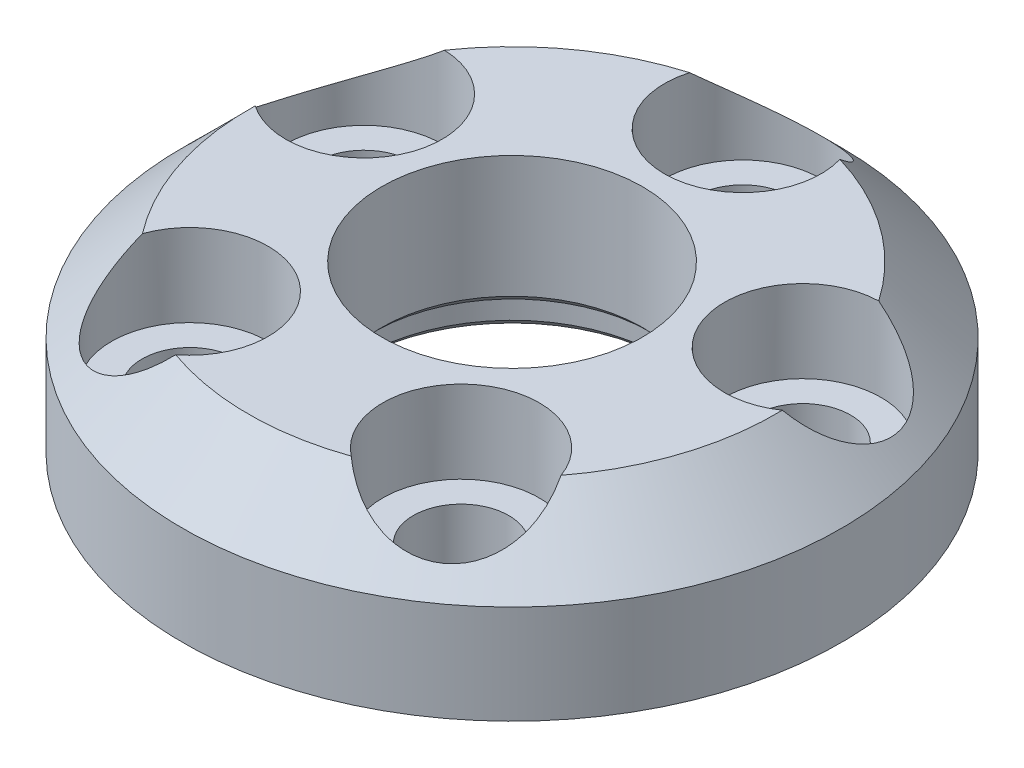
ISO-10303-21;
HEADER;
FILE_DESCRIPTION(('STEP AP214'),'2;1');
FILE_NAME('part.step','',(''),(''),'','','');
FILE_SCHEMA(('AUTOMOTIVE_DESIGN { 1 0 10303 214 1 1 1 1 }'));
ENDSEC;
DATA;
#1=APPLICATION_CONTEXT('core data for automotive mechanical design processes');
#2=APPLICATION_PROTOCOL_DEFINITION('international standard','automotive_design',2000,#1);
#3=PRODUCT_CONTEXT('',#1,'mechanical');
#4=PRODUCT('Part','Part','',(#3));
#5=PRODUCT_RELATED_PRODUCT_CATEGORY('part','',(#4));
#6=PRODUCT_DEFINITION_FORMATION('','',#4);
#7=PRODUCT_DEFINITION_CONTEXT('part definition',#1,'design');
#8=PRODUCT_DEFINITION('design','',#6,#7);
#9=PRODUCT_DEFINITION_SHAPE('','',#8);
#10=(LENGTH_UNIT() NAMED_UNIT(*) SI_UNIT(.MILLI.,.METRE.));
#11=(NAMED_UNIT(*) PLANE_ANGLE_UNIT() SI_UNIT($,.RADIAN.));
#12=(NAMED_UNIT(*) SI_UNIT($,.STERADIAN.) SOLID_ANGLE_UNIT());
#13=UNCERTAINTY_MEASURE_WITH_UNIT(LENGTH_MEASURE(1.E-05),#10,'distance_accuracy_value','');
#14=(GEOMETRIC_REPRESENTATION_CONTEXT(3) GLOBAL_UNCERTAINTY_ASSIGNED_CONTEXT((#13)) GLOBAL_UNIT_ASSIGNED_CONTEXT((#10,
#11,#12)) REPRESENTATION_CONTEXT('',''));
#15=CARTESIAN_POINT('',(0.,0.,0.));
#16=DIRECTION('',(0.,0.,1.));
#17=DIRECTION('',(1.,0.,0.));
#18=AXIS2_PLACEMENT_3D('',#15,#16,#17);
#19=CARTESIAN_POINT('',(0.,1.05000000002065,0.));
#20=DIRECTION('',(0.,-1.,0.));
#21=DIRECTION('',(0.,0.,-1.));
#22=AXIS2_PLACEMENT_3D('',#19,#20,#21);
#23=CONICAL_SURFACE('',#22,4.20750000006365,0.785398163397448);
#24=CARTESIAN_POINT('',(0.,1.29999999999999,0.));
#25=DIRECTION('',(0.,-1.,0.));
#26=DIRECTION('',(0.,0.,-1.));
#27=AXIS2_PLACEMENT_3D('',#24,#25,#26);
#28=CIRCLE('',#27,3.9575);
#29=CARTESIAN_POINT('',(0.,1.29999999999999,-3.9575));
#30=VERTEX_POINT('',#29);
#31=EDGE_CURVE('E203',#30,#30,#28,.F.);
#32=ORIENTED_EDGE('',*,*,#31,.T.);
#33=EDGE_LOOP('',(#32));
#34=FACE_BOUND('',#33,.T.);
#35=CARTESIAN_POINT('',(0.,1.05000000002065,0.));
#36=DIRECTION('',(0.,-1.,0.));
#37=DIRECTION('',(0.,0.,-1.));
#38=AXIS2_PLACEMENT_3D('',#35,#36,#37);
#39=CIRCLE('',#38,4.20750000006365);
#40=CARTESIAN_POINT('',(0.,1.05000000002065,-4.20750000006365));
#41=VERTEX_POINT('',#40);
#42=EDGE_CURVE('E20',#41,#41,#39,.F.);
#43=ORIENTED_EDGE('',*,*,#42,.F.);
#44=EDGE_LOOP('',(#43));
#45=FACE_BOUND('',#44,.T.);
#46=ADVANCED_FACE('F17',(#34,#45),#23,.F.);
#47=CARTESIAN_POINT('',(0.,5.,0.));
#48=DIRECTION('',(0.,-1.,0.));
#49=DIRECTION('',(0.,0.,-1.));
#50=AXIS2_PLACEMENT_3D('',#47,#48,#49);
#51=CYLINDRICAL_SURFACE('',#50,3.9575);
#52=CARTESIAN_POINT('',(0.,5.,0.));
#53=DIRECTION('',(0.,-1.,0.));
#54=DIRECTION('',(0.,0.,-1.));
#55=AXIS2_PLACEMENT_3D('',#52,#53,#54);
#56=CIRCLE('',#55,3.9575);
#57=CARTESIAN_POINT('',(0.,5.,-3.9575));
#58=VERTEX_POINT('',#57);
#59=EDGE_CURVE('E267',#58,#58,#56,.T.);
#60=ORIENTED_EDGE('',*,*,#59,.F.);
#61=EDGE_LOOP('',(#60));
#62=FACE_BOUND('',#61,.T.);
#63=ORIENTED_EDGE('',*,*,#31,.F.);
#64=EDGE_LOOP('',(#63));
#65=FACE_BOUND('',#64,.T.);
#66=ADVANCED_FACE('F307',(#62,#65),#51,.F.);
#67=CARTESIAN_POINT('',(0.,1.05,0.));
#68=DIRECTION('',(0.,-1.,0.));
#69=DIRECTION('',(0.,0.,-1.));
#70=AXIS2_PLACEMENT_3D('',#67,#68,#69);
#71=PLANE('',#70);
#72=CARTESIAN_POINT('',(0.,1.05,0.));
#73=DIRECTION('',(0.,-1.,0.));
#74=DIRECTION('',(0.,0.,-1.));
#75=AXIS2_PLACEMENT_3D('',#72,#73,#74);
#76=CIRCLE('',#75,4.55);
#77=CARTESIAN_POINT('',(0.,1.05,-4.55));
#78=VERTEX_POINT('',#77);
#79=EDGE_CURVE('E256',#78,#78,#76,.T.);
#80=ORIENTED_EDGE('',*,*,#79,.T.);
#81=EDGE_LOOP('',(#80));
#82=FACE_BOUND('',#81,.T.);
#83=ORIENTED_EDGE('',*,*,#42,.T.);
#84=EDGE_LOOP('',(#83));
#85=FACE_BOUND('',#84,.T.);
#86=ADVANCED_FACE('F305',(#82,#85),#71,.T.);
#87=CARTESIAN_POINT('',(6.65739561406605,5.,-2.16311896062471));
#88=DIRECTION('',(0.,1.,0.));
#89=DIRECTION('',(0.,0.,1.));
#90=AXIS2_PLACEMENT_3D('',#87,#88,#89);
#91=CYLINDRICAL_SURFACE('',#90,2.375);
#92=CARTESIAN_POINT('',(6.65739561406605,2.5,-2.16311896062471));
#93=DIRECTION('',(0.,1.,0.));
#94=DIRECTION('',(0.,0.,1.));
#95=AXIS2_PLACEMENT_3D('',#92,#93,#94);
#96=CIRCLE('',#95,2.375);
#97=CARTESIAN_POINT('',(6.65739561406605,2.5,0.211881039375292));
#98=VERTEX_POINT('',#97);
#99=EDGE_CURVE('E253',#98,#98,#96,.F.);
#100=ORIENTED_EDGE('',*,*,#99,.T.);
#101=EDGE_LOOP('',(#100));
#102=FACE_BOUND('',#101,.T.);
#103=CARTESIAN_POINT('',(6.65739561406605,5.,-2.16311896062471));
#104=DIRECTION('',(0.,1.,0.));
#105=DIRECTION('',(0.,0.,1.));
#106=AXIS2_PLACEMENT_3D('',#103,#104,#105);
#107=CIRCLE('',#106,2.375);
#108=CARTESIAN_POINT('',(7.99744233305101,5.,-0.202277357909784));
#109=VERTEX_POINT('',#108);
#110=CARTESIAN_POINT('',(6.58896240682385,5.,-4.53713283930077));
#111=VERTEX_POINT('',#110);
#112=EDGE_CURVE('E269',#109,#111,#107,.F.);
#113=ORIENTED_EDGE('',*,*,#112,.F.);
#114=CARTESIAN_POINT('',(6.58896240682386,5.,-4.53713283930077));
#115=CARTESIAN_POINT('',(6.61168549052719,4.98091261179798,-4.53778754445796));
#116=CARTESIAN_POINT('',(6.63449938435001,4.96190646302991,-4.5381186600226));
#117=CARTESIAN_POINT('',(6.81305091044634,4.81437584577262,-4.53812100420615));
#118=CARTESIAN_POINT('',(6.97251150821344,4.68982271408264,-4.52283383932132));
#119=CARTESIAN_POINT('',(7.2937930068652,4.45292029959728,-4.45712543363583));
#120=CARTESIAN_POINT('',(7.45561497281098,4.34057672966032,-4.40668782704675));
#121=CARTESIAN_POINT('',(7.72258986606131,4.1667617283506,-4.28913413469708));
#122=CARTESIAN_POINT('',(7.82929058832745,4.10052225084511,-4.2325363793644));
#123=CARTESIAN_POINT('',(8.0367904217062,3.97826366179571,-4.10037354950836));
#124=CARTESIAN_POINT('',(8.1375952063592,3.92223461131587,-4.02482709196718));
#125=CARTESIAN_POINT('',(8.2816352580781,3.84744549435546,-3.89709246736531));
#126=CARTESIAN_POINT('',(8.32868007869753,3.82396048375066,-3.85183768958102));
#127=CARTESIAN_POINT('',(8.41960901124543,3.78051651282155,-3.75671533555508));
#128=CARTESIAN_POINT('',(8.46349485400239,3.76055561276451,-3.7068503200455));
#129=CARTESIAN_POINT('',(8.54749718495559,3.72446476395734,-3.60277486745948));
#130=CARTESIAN_POINT('',(8.58761528313331,3.7083331743754,-3.54856630492814));
#131=CARTESIAN_POINT('',(8.66349905355313,3.68016136970405,-3.43621640281192));
#132=CARTESIAN_POINT('',(8.6992655877259,3.66812034353174,-3.37807584561334));
#133=CARTESIAN_POINT('',(8.7895427660731,3.64134756393503,-3.21584755478817));
#134=CARTESIAN_POINT('',(8.83938923634167,3.63074944667362,-3.10838043346482));
#135=CARTESIAN_POINT('',(8.92252645293727,3.62282131005212,-2.88686438308134));
#136=CARTESIAN_POINT('',(8.95582692757407,3.62548348405426,-2.77281936566305));
#137=CARTESIAN_POINT('',(9.00271940448269,3.64303966379213,-2.55249253077234));
#138=CARTESIAN_POINT('',(9.01781524978446,3.65681141311306,-2.44643561718636));
#139=CARTESIAN_POINT('',(9.03367029611364,3.69452158842767,-2.23508661485364));
#140=CARTESIAN_POINT('',(9.03442779662941,3.71846121997657,-2.12979461830544));
#141=CARTESIAN_POINT('',(9.02225156998822,3.77651581076964,-1.91893582688445));
#142=CARTESIAN_POINT('',(9.00883778553016,3.81095754109978,-1.81348836393115));
#143=CARTESIAN_POINT('',(8.96907223834274,3.88836860547014,-1.60841383635109));
#144=CARTESIAN_POINT('',(8.94272116371395,3.93133748590115,-1.50878646248436));
#145=CARTESIAN_POINT('',(8.8746307857363,4.03060935832863,-1.30430248561043));
#146=CARTESIAN_POINT('',(8.83133313398593,4.08792041907853,-1.20045758669257));
#147=CARTESIAN_POINT('',(8.73284523138109,4.21019799393751,-1.00323253873333));
#148=CARTESIAN_POINT('',(8.67762623445639,4.275182837246,-0.909878528694605));
#149=CARTESIAN_POINT('',(8.5301746658861,4.44243992644278,-0.694353779115268));
#150=CARTESIAN_POINT('',(8.43255634382121,4.54818539153483,-0.57849816893485));
#151=CARTESIAN_POINT('',(8.27595025881556,4.71336261278908,-0.423494618306618));
#152=CARTESIAN_POINT('',(8.22217414039353,4.76939156113126,-0.375038158511909));
#153=CARTESIAN_POINT('',(8.11180369040382,4.88333330893033,-0.284182944944327));
#154=CARTESIAN_POINT('',(8.0552138111568,4.9412430848968,-0.241775007450681));
#155=CARTESIAN_POINT('',(7.99744233305102,5.,-0.202277357909785));
#156=B_SPLINE_CURVE_WITH_KNOTS('',3,(#114,#115,#116,#117,#118,#119,#120,#121,#122,#123,#124,
#125,#126,#127,#128,#129,#130,#131,#132,#133,#134,#135,#136,#137,#138,#139,#140,#141,#142,#143,
#144,#145,#146,#147,#148,#149,#150,#151,#152,#153,#154,#155),.UNSPECIFIED.,.F.,.F.,(4,2,2,2,2,2,
2,2,2,2,2,2,2,2,2,2,2,2,2,2,4),(0.,0.0890754069378642,0.694636193104968,1.30047911246889,
1.71224934762148,2.12361659501794,2.33147730056537,2.53922323677842,2.74687999402518,
2.95449555272102,3.30914540054866,3.66358648255868,3.98613266475483,4.30871710032743,
4.6425904982899,4.97644614032434,5.35382876746888,5.73213175287506,6.28323537652343,
6.55764806842834,6.83163956859994),.UNSPECIFIED.);
#157=EDGE_CURVE('E120',#111,#109,#156,.T.);
#158=ORIENTED_EDGE('',*,*,#157,.F.);
#159=EDGE_LOOP('',(#113,#158));
#160=FACE_BOUND('',#159,.T.);
#161=ADVANCED_FACE('F298',(#102,#160),#91,.F.);
#162=CARTESIAN_POINT('',(4.11449676604736,5.,5.6631189606246));
#163=DIRECTION('',(0.,1.,0.));
#164=DIRECTION('',(0.,0.,1.));
#165=AXIS2_PLACEMENT_3D('',#162,#163,#164);
#166=CYLINDRICAL_SURFACE('',#165,2.375);
#167=CARTESIAN_POINT('',(6.35117111111994,5.,4.86442447955305));
#168=CARTESIAN_POINT('',(6.37704195206171,4.9353637506658,4.93693407841781));
#169=CARTESIAN_POINT('',(6.39969130032373,4.87175413836563,5.01144766463847));
#170=CARTESIAN_POINT('',(6.43788811681571,4.74682407792038,5.16438323525823));
#171=CARTESIAN_POINT('',(6.45342068502409,4.68550867712779,5.2428130418105));
#172=CARTESIAN_POINT('',(6.48834299922461,4.50505435076749,5.48430181548647));
#173=CARTESIAN_POINT('',(6.495735320817,4.39017772298817,5.65270007406059));
#174=CARTESIAN_POINT('',(6.47584300461324,4.21022842866832,5.94410196063647));
#175=CARTESIAN_POINT('',(6.45854460122024,4.14071867290941,6.06509864348626));
#176=CARTESIAN_POINT('',(6.40371108932668,4.012016487059,6.30774423592262));
#177=CARTESIAN_POINT('',(6.36622962378682,3.95279725596156,6.42939057413711));
#178=CARTESIAN_POINT('',(6.26899730109819,3.84640276466765,6.67099721571224));
#179=CARTESIAN_POINT('',(6.20902339702279,3.79935639010419,6.7909277044322));
#180=CARTESIAN_POINT('',(6.10243714766377,3.74049343033318,6.96440755377631));
#181=CARTESIAN_POINT('',(6.06411922099829,3.72281891537604,7.02118584661632));
#182=CARTESIAN_POINT('',(5.98210881911536,3.69164349290584,7.13192679967233));
#183=CARTESIAN_POINT('',(5.93841750933769,3.67814168259352,7.1858900668394));
#184=CARTESIAN_POINT('',(5.81364199127453,3.6477081128766,7.32669873564073));
#185=CARTESIAN_POINT('',(5.72771024745248,3.63493822359387,7.41026572774374));
#186=CARTESIAN_POINT('',(5.54370661334865,3.6229839399976,7.56373318955158));
#187=CARTESIAN_POINT('',(5.44564386305705,3.62378937862513,7.63364384729005));
#188=CARTESIAN_POINT('',(5.25112977501392,3.63812539835151,7.7512516356185));
#189=CARTESIAN_POINT('',(5.15549652481192,3.65037641250422,7.80047037206807));
#190=CARTESIAN_POINT('',(4.9600978341909,3.685207803051,7.88503782314842));
#191=CARTESIAN_POINT('',(4.86033192903493,3.70778934404617,7.92038497314556));
#192=CARTESIAN_POINT('',(4.65197515384877,3.76435868696757,7.97921782871455));
#193=CARTESIAN_POINT('',(4.54327907367299,3.7990689477248,8.0016278715149));
#194=CARTESIAN_POINT('',(4.32728633869306,3.87786522047338,8.03108277783815));
#195=CARTESIAN_POINT('',(4.219990185089,3.92195449759357,8.03812228075724));
#196=CARTESIAN_POINT('',(3.96914723344378,4.03625796803517,8.03811438612381));
#197=CARTESIAN_POINT('',(3.82721992401726,4.11004911926677,8.02474006058905));
#198=CARTESIAN_POINT('',(3.55399949426322,4.26946656559372,7.97523080996273));
#199=CARTESIAN_POINT('',(3.42274857390348,4.35513651891785,7.93901008964269));
#200=CARTESIAN_POINT('',(3.17917165907156,4.53130053721701,7.84986890646318));
#201=CARTESIAN_POINT('',(3.06626689377332,4.62141618925218,7.79775383006375));
#202=CARTESIAN_POINT('',(2.85458806785598,4.80700991231303,7.67998959884704));
#203=CARTESIAN_POINT('',(2.75569746154793,4.90243327737722,7.61446469807276));
#204=CARTESIAN_POINT('',(2.66372279178544,5.,7.5435125033715));
#205=B_SPLINE_CURVE_WITH_KNOTS('',3,(#167,#168,#169,#170,#171,#172,#173,#174,#175,#176,#177,
#178,#179,#180,#181,#182,#183,#184,#185,#186,#187,#188,#189,#190,#191,#192,#193,#194,#195,#196,
#197,#198,#199,#200,#201,#202,#203,#204),.UNSPECIFIED.,.F.,.F.,(4,2,2,2,2,2,2,2,2,2,2,2,2,2,2,2,
2,2,4),(0.,0.301376958557415,0.603382042656228,1.21094291731561,1.63123392906632,
2.05041335677679,2.47386449097104,2.68575618896703,2.89760201028909,3.25701134082632,
3.61615150855684,3.9394055767465,4.26269609562739,4.60999243715844,4.95740988184744,
5.43608394192228,5.91656636032629,6.37589608932966,6.83114817989908),.UNSPECIFIED.);
#206=CARTESIAN_POINT('',(6.35117111111994,5.,4.86442447955305));
#207=VERTEX_POINT('',#206);
#208=CARTESIAN_POINT('',(2.66372279178544,5.,7.5435125033715));
#209=VERTEX_POINT('',#208);
#210=EDGE_CURVE('E112',#207,#209,#205,.T.);
#211=ORIENTED_EDGE('',*,*,#210,.F.);
#212=CARTESIAN_POINT('',(4.11449676604736,5.,5.6631189606246));
#213=DIRECTION('',(0.,1.,0.));
#214=DIRECTION('',(0.,0.,1.));
#215=AXIS2_PLACEMENT_3D('',#212,#213,#214);
#216=CIRCLE('',#215,2.375);
#217=EDGE_CURVE('E272',#209,#207,#216,.F.);
#218=ORIENTED_EDGE('',*,*,#217,.F.);
#219=EDGE_LOOP('',(#211,#218));
#220=FACE_BOUND('',#219,.T.);
#221=CARTESIAN_POINT('',(4.11449676604736,2.5,5.6631189606246));
#222=DIRECTION('',(0.,1.,0.));
#223=DIRECTION('',(0.,0.,1.));
#224=AXIS2_PLACEMENT_3D('',#221,#222,#223);
#225=CIRCLE('',#224,2.375);
#226=CARTESIAN_POINT('',(4.11449676604736,2.5,8.0381189606246));
#227=VERTEX_POINT('',#226);
#228=EDGE_CURVE('E255',#227,#227,#225,.F.);
#229=ORIENTED_EDGE('',*,*,#228,.T.);
#230=EDGE_LOOP('',(#229));
#231=FACE_BOUND('',#230,.T.);
#232=ADVANCED_FACE('F294',(#220,#231),#166,.F.);
#233=CARTESIAN_POINT('',(-4.11449676604728,5.,5.66311896062466));
#234=DIRECTION('',(0.,1.,0.));
#235=DIRECTION('',(0.,0.,1.));
#236=AXIS2_PLACEMENT_3D('',#233,#234,#235);
#237=CYLINDRICAL_SURFACE('',#236,2.375);
#238=CARTESIAN_POINT('',(-2.66372279178533,5.,7.54351250337154));
#239=CARTESIAN_POINT('',(-2.72482769902266,4.93521922624391,7.59062757394271));
#240=CARTESIAN_POINT('',(-2.78883918881428,4.87147385269094,7.63528629851688));
#241=CARTESIAN_POINT('',(-2.92281161403511,4.74627196733094,7.71903873690898));
#242=CARTESIAN_POINT('',(-2.99278572811277,4.68482098119516,7.75811958471626));
#243=CARTESIAN_POINT('',(-3.21159907398499,4.50452727349498,7.86579294711944));
#244=CARTESIAN_POINT('',(-3.36917901556749,4.38990490750997,7.92469667844743));
#245=CARTESIAN_POINT('',(-3.62761598211338,4.22573585431864,7.98959313098151));
#246=CARTESIAN_POINT('',(-3.72186441064643,4.17021667714646,8.00746712899458));
#247=CARTESIAN_POINT('',(-3.91501869544087,4.06528055393191,8.03172159954815));
#248=CARTESIAN_POINT('',(-4.01391701423161,4.01585417261802,8.03812005669356));
#249=CARTESIAN_POINT('',(-4.22295994259197,3.92060471524675,8.03811777864604));
#250=CARTESIAN_POINT('',(-4.33337846277449,3.87536771166195,8.03067453654545));
#251=CARTESIAN_POINT('',(-4.5556704561195,3.79484698330107,7.99947950643908));
#252=CARTESIAN_POINT('',(-4.66754445672322,3.75956697816432,7.97572163512009));
#253=CARTESIAN_POINT('',(-4.89005701704677,3.70039000757432,7.91092210085342));
#254=CARTESIAN_POINT('',(-5.00068585155837,3.67655453226822,7.86978925632878));
#255=CARTESIAN_POINT('',(-5.2161746508618,3.64184146178102,7.77048215287404));
#256=CARTESIAN_POINT('',(-5.32103803000319,3.63095611684498,7.712318111932));
#257=CARTESIAN_POINT('',(-5.51347436786485,3.62307441492482,7.58555078765257));
#258=CARTESIAN_POINT('',(-5.60175598429402,3.6250828231542,7.51808085687294));
#259=CARTESIAN_POINT('',(-5.76746566641422,3.6405701144819,7.37206887076848));
#260=CARTESIAN_POINT('',(-5.84489458973205,3.65404809060938,7.2935276913266));
#261=CARTESIAN_POINT('',(-5.98525573682673,3.69132429497085,7.13015703650193));
#262=CARTESIAN_POINT('',(-6.04850420366573,3.71485379339385,7.04553599650558));
#263=CARTESIAN_POINT('',(-6.16209473884334,3.77117984359519,6.87093711858124));
#264=CARTESIAN_POINT('',(-6.21243460566365,3.80397797410526,6.78095837013412));
#265=CARTESIAN_POINT('',(-6.30379145059637,3.88080788433508,6.59032501082653));
#266=CARTESIAN_POINT('',(-6.34365893662544,3.92555544387131,6.489411338072));
#267=CARTESIAN_POINT('',(-6.40863154709803,4.02309360885047,6.28675234530232));
#268=CARTESIAN_POINT('',(-6.43372679411633,4.07588956620654,6.18500651485319));
#269=CARTESIAN_POINT('',(-6.47786851287403,4.21203029707939,5.93975471667396));
#270=CARTESIAN_POINT('',(-6.4898145792419,4.29882369715797,5.79687338153015));
#271=CARTESIAN_POINT('',(-6.48916499144109,4.48267896936242,5.51784004309524));
#272=CARTESIAN_POINT('',(-6.4765262054929,4.5797586051658,5.38170029699711));
#273=CARTESIAN_POINT('',(-6.4415189120108,4.73213896485771,5.18327513278006));
#274=CARTESIAN_POINT('',(-6.4269089149247,4.78470753191205,5.1173711515644));
#275=CARTESIAN_POINT('',(-6.39267859338162,4.8912814215238,4.98864255084173));
#276=CARTESIAN_POINT('',(-6.37308350663373,4.94527831422448,4.92580426631595));
#277=CARTESIAN_POINT('',(-6.35117111111987,5.,4.86442447955314));
#278=B_SPLINE_CURVE_WITH_KNOTS('',3,(#238,#239,#240,#241,#242,#243,#244,#245,#246,#247,#248,
#249,#250,#251,#252,#253,#254,#255,#256,#257,#258,#259,#260,#261,#262,#263,#264,#265,#266,#267,
#268,#269,#270,#271,#272,#273,#274,#275,#276,#277),.UNSPECIFIED.,.F.,.F.,(4,2,2,2,2,2,2,2,2,2,2,
2,2,2,2,2,2,2,2,4),(0.,0.302036921515757,0.604759640400018,1.21094783408118,1.54276362430079,
1.87405893291548,2.23132111439869,2.58871658231227,2.94801138398494,3.30709106430718,
3.63880596608702,3.97049463952199,4.29382173076269,4.61720392773166,4.96795305313659,
5.31893644055408,5.81904734328484,6.32003643429422,6.57653024161495,6.83175049353041),.UNSPECIFIED.);
#279=CARTESIAN_POINT('',(-2.66372279178533,5.,7.54351250337154));
#280=VERTEX_POINT('',#279);
#281=CARTESIAN_POINT('',(-6.35117111111987,5.,4.86442447955314));
#282=VERTEX_POINT('',#281);
#283=EDGE_CURVE('E76',#280,#282,#278,.T.);
#284=ORIENTED_EDGE('',*,*,#283,.F.);
#285=CARTESIAN_POINT('',(-4.11449676604728,5.,5.66311896062466));
#286=DIRECTION('',(0.,1.,0.));
#287=DIRECTION('',(0.,0.,1.));
#288=AXIS2_PLACEMENT_3D('',#285,#286,#287);
#289=CIRCLE('',#288,2.375);
#290=EDGE_CURVE('E69',#282,#280,#289,.F.);
#291=ORIENTED_EDGE('',*,*,#290,.F.);
#292=EDGE_LOOP('',(#284,#291));
#293=FACE_BOUND('',#292,.T.);
#294=CARTESIAN_POINT('',(-4.11449676604728,2.5,5.66311896062466));
#295=DIRECTION('',(0.,1.,0.));
#296=DIRECTION('',(0.,0.,1.));
#297=AXIS2_PLACEMENT_3D('',#294,#295,#296);
#298=CIRCLE('',#297,2.375);
#299=CARTESIAN_POINT('',(-4.11449676604728,2.5,8.03811896062465));
#300=VERTEX_POINT('',#299);
#301=EDGE_CURVE('E259',#300,#300,#298,.F.);
#302=ORIENTED_EDGE('',*,*,#301,.T.);
#303=EDGE_LOOP('',(#302));
#304=FACE_BOUND('',#303,.T.);
#305=ADVANCED_FACE('F149',(#293,#304),#237,.F.);
#306=CARTESIAN_POINT('',(-6.65739561406608,5.,-2.16311896062461));
#307=DIRECTION('',(0.,1.,0.));
#308=DIRECTION('',(0.,0.,1.));
#309=AXIS2_PLACEMENT_3D('',#306,#307,#308);
#310=CYLINDRICAL_SURFACE('',#309,2.375);
#311=CARTESIAN_POINT('',(-6.65739561406608,5.,-2.16311896062461));
#312=DIRECTION('',(0.,1.,0.));
#313=DIRECTION('',(0.,0.,1.));
#314=AXIS2_PLACEMENT_3D('',#311,#312,#313);
#315=CIRCLE('',#314,2.375);
#316=CARTESIAN_POINT('',(-6.58896240682392,5.,-4.53713283930067));
#317=VERTEX_POINT('',#316);
#318=CARTESIAN_POINT('',(-7.99744233305102,5.,-0.202277357909671));
#319=VERTEX_POINT('',#318);
#320=EDGE_CURVE('E61',#317,#319,#315,.F.);
#321=ORIENTED_EDGE('',*,*,#320,.F.);
#322=CARTESIAN_POINT('',(-7.99744233305102,5.,-0.20227735790967));
#323=CARTESIAN_POINT('',(-8.06099231499097,4.93536379228864,-0.245732328910933));
#324=CARTESIAN_POINT('',(-8.12311397049103,4.87175422043338,-0.292702100948284));
#325=CARTESIAN_POINT('',(-8.24390904384477,4.74682423740684,-0.393977976565144));
#326=CARTESIAN_POINT('',(-8.30257500507694,4.6855088735862,-0.448299166408644));
#327=CARTESIAN_POINT('',(-8.47277134387626,4.50505449757495,-0.623140875779211));
#328=CARTESIAN_POINT('',(-8.57773394621032,4.39017779082952,-0.755032906263664));
#329=CARTESIAN_POINT('',(-8.73292251570615,4.21022842690716,-1.00247449066906));
#330=CARTESIAN_POINT('',(-8.79004788017884,4.14071866971152,-1.11053061256311));
#331=CARTESIAN_POINT('',(-8.88831013749237,4.01201648427506,-1.33906535012642));
#332=CARTESIAN_POINT('',(-8.92948891771748,3.95279725455956,-1.45951035438464));
#333=CARTESIAN_POINT('',(-8.99283917816522,3.84640269270142,-1.71212612890337));
#334=CARTESIAN_POINT('',(-9.01481265794584,3.79935626381643,-1.84440389696353));
#335=CARTESIAN_POINT('',(-9.03055143195743,3.74049330646968,-2.04740197320948));
#336=CARTESIAN_POINT('',(-9.03292500790424,3.72281882197654,-2.11585920056058));
#337=CARTESIAN_POINT('',(-9.03166907696666,3.69164345667432,-2.25365483881889));
#338=CARTESIAN_POINT('',(-9.02804087026679,3.67814167267235,-2.32299305564575));
#339=CARTESIAN_POINT('',(-9.009860759824,3.64770828090739,-2.51024965538537));
#340=CARTESIAN_POINT('',(-8.98946030997727,3.63493841176111,-2.62836502644938));
#341=CARTESIAN_POINT('',(-8.93080430818073,3.6229839750982,-2.86067762883986));
#342=CARTESIAN_POINT('',(-8.89256180699708,3.62378949281528,-2.97487765865217));
#343=CARTESIAN_POINT('',(-8.80432311096123,3.6381255268146,-3.18436175212919));
#344=CARTESIAN_POINT('',(-8.75588260807562,3.65037688468368,-3.28039583606691));
#345=CARTESIAN_POINT('',(-8.64750609819618,3.68521036192259,-3.46366562344366));
#346=CARTESIAN_POINT('',(-8.58756979186391,3.70779275032261,-3.55090109768604));
#347=CARTESIAN_POINT('',(-8.45668239761068,3.76305398243847,-3.71704192876857));
#348=CARTESIAN_POINT('',(-8.38548117408974,3.79598490323091,-3.7956647238048));
#349=CARTESIAN_POINT('',(-8.2357471233863,3.87047047183456,-3.94084795371077));
#350=CARTESIAN_POINT('',(-8.15721260563855,3.9120271108708,-4.00740559671318));
#351=CARTESIAN_POINT('',(-7.98494023104446,4.00816151229527,-4.13572712226012));
#352=CARTESIAN_POINT('',(-7.89052973905914,4.0637179947678,-4.19584853719895));
#353=CARTESIAN_POINT('',(-7.69805703921488,4.18248991860572,-4.30080349455362));
#354=CARTESIAN_POINT('',(-7.59999062931674,4.24571437391869,-4.34561880342203));
#355=CARTESIAN_POINT('',(-7.36010650018649,4.40683424280841,-4.43679681445292));
#356=CARTESIAN_POINT('',(-7.21757016395329,4.5079664157932,-4.47557325150773));
#357=CARTESIAN_POINT('',(-6.93484754324334,4.71933754700007,-4.52622686839801));
#358=CARTESIAN_POINT('',(-6.79465991563605,4.82957107072052,-4.53811998182633));
#359=CARTESIAN_POINT('',(-6.63450044396378,4.96190568486122,-4.538118790292));
#360=CARTESIAN_POINT('',(-6.61168660367837,4.98091179613429,-4.53778771338955));
#361=CARTESIAN_POINT('',(-6.58896240682392,5.,-4.53713283930067));
#362=B_SPLINE_CURVE_WITH_KNOTS('',3,(#322,#323,#324,#325,#326,#327,#328,#329,#330,#331,#332,
#333,#334,#335,#336,#337,#338,#339,#340,#341,#342,#343,#344,#345,#346,#347,#348,#349,#350,#351,
#352,#353,#354,#355,#356,#357,#358,#359,#360,#361),.UNSPECIFIED.,.F.,.F.,(4,2,2,2,2,2,2,2,2,2,2,
2,2,2,2,2,2,2,2,4),(0.,0.301376764221669,0.603381654235885,1.21094291592418,1.63123393740659,
2.05041335538963,2.47386506093743,2.68575648228138,2.89760200694961,3.25700799610832,
3.61615150494913,3.93941958783336,4.26269608941554,4.59455320481937,4.92648701396258,
5.29996338994439,5.67388313402375,6.20823716879408,6.7422744118348,6.83134981877262),.UNSPECIFIED.);
#363=EDGE_CURVE('E74',#319,#317,#362,.T.);
#364=ORIENTED_EDGE('',*,*,#363,.F.);
#365=EDGE_LOOP('',(#321,#364));
#366=FACE_BOUND('',#365,.T.);
#367=CARTESIAN_POINT('',(-6.65739561406608,2.5,-2.16311896062461));
#368=DIRECTION('',(0.,1.,0.));
#369=DIRECTION('',(0.,0.,1.));
#370=AXIS2_PLACEMENT_3D('',#367,#368,#369);
#371=CIRCLE('',#370,2.375);
#372=CARTESIAN_POINT('',(-6.65739561406608,2.5,0.211881039375386));
#373=VERTEX_POINT('',#372);
#374=EDGE_CURVE('E287',#373,#373,#371,.F.);
#375=ORIENTED_EDGE('',*,*,#374,.T.);
#376=EDGE_LOOP('',(#375));
#377=FACE_BOUND('',#376,.T.);
#378=ADVANCED_FACE('F78',(#366,#377),#310,.F.);
#379=CARTESIAN_POINT('',(0.,5.,0.));
#380=DIRECTION('',(0.,1.,0.));
#381=DIRECTION('',(0.,0.,1.));
#382=AXIS2_PLACEMENT_3D('',#379,#380,#381);
#383=PLANE('',#382);
#384=ORIENTED_EDGE('',*,*,#59,.T.);
#385=EDGE_LOOP('',(#384));
#386=FACE_BOUND('',#385,.T.);
#387=CARTESIAN_POINT('',(0.,5.,0.));
#388=DIRECTION('',(0.,-1.,0.));
#389=DIRECTION('',(0.,0.,-1.));
#390=AXIS2_PLACEMENT_3D('',#387,#388,#389);
#391=CIRCLE('',#390,7.99999999999997);
#392=CARTESIAN_POINT('',(2.27896839310741,5.,-7.66852678571425));
#393=VERTEX_POINT('',#392);
#394=EDGE_CURVE('E282',#393,#111,#391,.T.);
#395=ORIENTED_EDGE('',*,*,#394,.F.);
#396=CARTESIAN_POINT('',(0.,5.,-7.));
#397=DIRECTION('',(0.,1.,0.));
#398=DIRECTION('',(0.,0.,1.));
#399=AXIS2_PLACEMENT_3D('',#396,#397,#398);
#400=CIRCLE('',#399,2.375);
#401=CARTESIAN_POINT('',(-2.27896839310741,5.,-7.66852678571424));
#402=VERTEX_POINT('',#401);
#403=EDGE_CURVE('E262',#393,#402,#400,.F.);
#404=ORIENTED_EDGE('',*,*,#403,.T.);
#405=CARTESIAN_POINT('',(0.,5.,0.));
#406=DIRECTION('',(0.,-1.,0.));
#407=DIRECTION('',(0.,0.,-1.));
#408=AXIS2_PLACEMENT_3D('',#405,#406,#407);
#409=CIRCLE('',#408,7.99999999999996);
#410=EDGE_CURVE('E35',#317,#402,#409,.T.);
#411=ORIENTED_EDGE('',*,*,#410,.F.);
#412=ORIENTED_EDGE('',*,*,#320,.T.);
#413=CARTESIAN_POINT('',(0.,5.,0.));
#414=DIRECTION('',(0.,-1.,0.));
#415=DIRECTION('',(0.,0.,-1.));
#416=AXIS2_PLACEMENT_3D('',#413,#414,#415);
#417=CIRCLE('',#416,7.99999999999997);
#418=EDGE_CURVE('E66',#282,#319,#417,.T.);
#419=ORIENTED_EDGE('',*,*,#418,.F.);
#420=ORIENTED_EDGE('',*,*,#290,.T.);
#421=CARTESIAN_POINT('',(0.,5.,0.));
#422=DIRECTION('',(0.,-1.,0.));
#423=DIRECTION('',(0.,0.,-1.));
#424=AXIS2_PLACEMENT_3D('',#421,#422,#423);
#425=CIRCLE('',#424,7.99999999999997);
#426=EDGE_CURVE('E276',#209,#280,#425,.T.);
#427=ORIENTED_EDGE('',*,*,#426,.F.);
#428=ORIENTED_EDGE('',*,*,#217,.T.);
#429=CARTESIAN_POINT('',(0.,5.,0.));
#430=DIRECTION('',(0.,-1.,0.));
#431=DIRECTION('',(0.,0.,-1.));
#432=AXIS2_PLACEMENT_3D('',#429,#430,#431);
#433=CIRCLE('',#432,7.99999999999996);
#434=EDGE_CURVE('E279',#109,#207,#433,.T.);
#435=ORIENTED_EDGE('',*,*,#434,.F.);
#436=ORIENTED_EDGE('',*,*,#112,.T.);
#437=EDGE_LOOP('',(#395,#404,#411,#412,#419,#420,#427,#428,#435,#436));
#438=FACE_BOUND('',#437,.T.);
#439=ADVANCED_FACE('F64',(#386,#438),#383,.T.);
#440=CARTESIAN_POINT('',(0.,5.,-7.));
#441=DIRECTION('',(0.,1.,0.));
#442=DIRECTION('',(0.,0.,1.));
#443=AXIS2_PLACEMENT_3D('',#440,#441,#442);
#444=CYLINDRICAL_SURFACE('',#443,2.375);
#445=ORIENTED_EDGE('',*,*,#403,.F.);
#446=CARTESIAN_POINT('',(-2.27896839310741,5.,-7.66852678571425));
#447=CARTESIAN_POINT('',(-2.25727587723692,4.9353605698156,-7.74239849042597));
#448=CARTESIAN_POINT('',(-2.23180112515334,4.87174860214254,-7.81599693121851));
#449=CARTESIAN_POINT('',(-2.17280808077883,4.74681399588239,-7.9621813301107));
#450=CARTESIAN_POINT('',(-2.13927312836917,4.68549640710832,-8.03476485722135));
#451=CARTESIAN_POINT('',(-2.02557726723135,4.5050437748566,-8.25065870492663));
#452=CARTESIAN_POINT('',(-1.9325667707158,4.39016823363075,-8.3912399009688));
#453=CARTESIAN_POINT('',(-1.74523185354898,4.21024134574211,-8.61526826941642));
#454=CARTESIAN_POINT('',(-1.66015259033352,4.14074782433391,-8.70296801130991));
#455=CARTESIAN_POINT('',(-1.47310438133077,4.01202042708678,-8.86707416623676));
#456=CARTESIAN_POINT('',(-1.37117627867318,3.95276243292529,-8.94350706359683));
#457=CARTESIAN_POINT('',(-1.20601095834581,3.87310314246094,-9.04706412478273));
#458=CARTESIAN_POINT('',(-1.1485312587774,3.84796667001883,-9.07989582363198));
#459=CARTESIAN_POINT('',(-1.02989306482142,3.80125897325043,-9.14111915814523));
#460=CARTESIAN_POINT('',(-0.968736730638826,3.7796856827693,-9.16951336642513));
#461=CARTESIAN_POINT('',(-0.843220698790315,3.74044711252935,-9.22130777307266));
#462=CARTESIAN_POINT('',(-0.778864616302154,3.72277753984939,-9.2447134563147));
#463=CARTESIAN_POINT('',(-0.647479796641582,3.69162133195456,-9.28607473283981));
#464=CARTESIAN_POINT('',(-0.580452390341391,3.67813264248205,-9.3040330025914));
#465=CARTESIAN_POINT('',(-0.429063443110808,3.65304853273882,-9.33747730047778));
#466=CARTESIAN_POINT('',(-0.344186733567034,3.64255682952093,-9.35150474004341));
#467=CARTESIAN_POINT('',(-0.172885215814583,3.62853147970634,-9.37026787139682));
#468=CARTESIAN_POINT('',(-0.0864607773486782,3.62499619306282,-9.37500575329251));
#469=CARTESIAN_POINT('',(0.113649696024511,3.62500500408696,-9.37499243749635));
#470=CARTESIAN_POINT('',(0.227362179066871,3.63112492186581,-9.36678873123433));
#471=CARTESIAN_POINT('',(0.451240164289829,3.65529079922963,-9.33448757534707));
#472=CARTESIAN_POINT('',(0.561402428186621,3.67334734080983,-9.31037602321652));
#473=CARTESIAN_POINT('',(0.774594996734526,3.72037947724176,-9.24787046502451));
#474=CARTESIAN_POINT('',(0.877651741782316,3.74931168136686,-9.20953322303905));
#475=CARTESIAN_POINT('',(1.07485404125482,3.81683978935593,-9.12061933414729));
#476=CARTESIAN_POINT('',(1.16899921901793,3.85543610143772,-9.07004217022224));
#477=CARTESIAN_POINT('',(1.35257232238769,3.94360208281365,-8.95540442463794));
#478=CARTESIAN_POINT('',(1.44133568746713,3.99370755667155,-8.8906978386313));
#479=CARTESIAN_POINT('',(1.60646821338559,4.10171301746697,-8.75256874731324));
#480=CARTESIAN_POINT('',(1.68282686327582,4.15961953929811,-8.67913894077084));
#481=CARTESIAN_POINT('',(1.85485637284062,4.30966385803817,-8.49096000643708));
#482=CARTESIAN_POINT('',(1.94349205664396,4.40538360308738,-8.37261955321175));
#483=CARTESIAN_POINT('',(2.09485588998057,4.60678919350708,-8.12822948593081));
#484=CARTESIAN_POINT('',(2.15756741003209,4.71248138264863,-8.00217498289622));
#485=CARTESIAN_POINT('',(2.2216463943333,4.85094842546494,-7.84039648110208));
#486=CARTESIAN_POINT('',(2.23432001541212,4.88047883419924,-7.8060792136976));
#487=CARTESIAN_POINT('',(2.25792449545223,4.93993178692087,-7.737371230661));
#488=CARTESIAN_POINT('',(2.26886030651275,4.9698529437873,-7.70298101740026));
#489=CARTESIAN_POINT('',(2.27896839310878,4.99999999999953,-7.66852678571439));
#490=B_SPLINE_CURVE_WITH_KNOTS('',3,(#446,#447,#448,#449,#450,#451,#452,#453,#454,#455,#456,
#457,#458,#459,#460,#461,#462,#463,#464,#465,#466,#467,#468,#469,#470,#471,#472,#473,#474,#475,
#476,#477,#478,#479,#480,#481,#482,#483,#484,#485,#486,#487,#488,#489),.UNSPECIFIED.,.F.,.F.,(4,
2,2,2,2,2,2,2,2,2,2,2,2,2,2,2,2,2,2,2,2,4),(0.,0.301389475785998,0.603407351737879,
1.21094300796333,1.63118028704258,2.05041342237854,2.26256777532347,2.4745986727498,
2.68639522600766,2.89808754843577,3.15727402771724,3.41639939379354,3.75701070900353,
4.09792438689288,4.43749211100538,4.77707418108647,5.13792084055411,5.49907168095495,
6.02464747071208,6.55055987851527,6.69158462194915,6.83219999872099),.UNSPECIFIED.);
#491=EDGE_CURVE('E81',#402,#393,#490,.T.);
#492=ORIENTED_EDGE('',*,*,#491,.F.);
#493=EDGE_LOOP('',(#445,#492));
#494=FACE_BOUND('',#493,.T.);
#495=CARTESIAN_POINT('',(0.,2.5,-7.));
#496=DIRECTION('',(0.,1.,0.));
#497=DIRECTION('',(0.,0.,1.));
#498=AXIS2_PLACEMENT_3D('',#495,#496,#497);
#499=CIRCLE('',#498,2.375);
#500=CARTESIAN_POINT('',(0.,2.5,-4.625));
#501=VERTEX_POINT('',#500);
#502=EDGE_CURVE('E285',#501,#501,#499,.F.);
#503=ORIENTED_EDGE('',*,*,#502,.T.);
#504=EDGE_LOOP('',(#503));
#505=FACE_BOUND('',#504,.T.);
#506=ADVANCED_FACE('F136',(#494,#505),#444,.F.);
#507=CARTESIAN_POINT('',(0.,1.05,0.));
#508=DIRECTION('',(0.,-1.,0.));
#509=DIRECTION('',(0.,0.,-1.));
#510=AXIS2_PLACEMENT_3D('',#507,#508,#509);
#511=CYLINDRICAL_SURFACE('',#510,4.55);
#512=CARTESIAN_POINT('',(0.,0.249999999994088,0.));
#513=DIRECTION('',(0.,-1.,0.));
#514=DIRECTION('',(0.,0.,-1.));
#515=AXIS2_PLACEMENT_3D('',#512,#513,#514);
#516=CIRCLE('',#515,4.54999999999472);
#517=CARTESIAN_POINT('',(0.,0.249999999994088,-4.54999999999472));
#518=VERTEX_POINT('',#517);
#519=EDGE_CURVE('E133',#518,#518,#516,.T.);
#520=ORIENTED_EDGE('',*,*,#519,.T.);
#521=EDGE_LOOP('',(#520));
#522=FACE_BOUND('',#521,.T.);
#523=ORIENTED_EDGE('',*,*,#79,.F.);
#524=EDGE_LOOP('',(#523));
#525=FACE_BOUND('',#524,.T.);
#526=ADVANCED_FACE('F140',(#522,#525),#511,.F.);
#527=CARTESIAN_POINT('',(8.10739561406605,2.5,-2.16311896062471));
#528=DIRECTION('',(0.,-1.,0.));
#529=DIRECTION('',(0.,0.,-1.));
#530=AXIS2_PLACEMENT_3D('',#527,#528,#529);
#531=PLANE('',#530);
#532=ORIENTED_EDGE('',*,*,#99,.F.);
#533=EDGE_LOOP('',(#532));
#534=FACE_BOUND('',#533,.T.);
#535=CARTESIAN_POINT('',(6.65739561406605,2.5,-2.16311896062471));
#536=DIRECTION('',(0.,1.,0.));
#537=DIRECTION('',(0.,0.,1.));
#538=AXIS2_PLACEMENT_3D('',#535,#536,#537);
#539=CIRCLE('',#538,1.45);
#540=CARTESIAN_POINT('',(6.65739561406605,2.5,-0.713118960624706));
#541=VERTEX_POINT('',#540);
#542=EDGE_CURVE('E134',#541,#541,#539,.F.);
#543=ORIENTED_EDGE('',*,*,#542,.T.);
#544=EDGE_LOOP('',(#543));
#545=FACE_BOUND('',#544,.T.);
#546=ADVANCED_FACE('F242',(#534,#545),#531,.F.);
#547=CARTESIAN_POINT('',(5.56449676604736,2.5,5.6631189606246));
#548=DIRECTION('',(0.,-1.,0.));
#549=DIRECTION('',(0.,0.,-1.));
#550=AXIS2_PLACEMENT_3D('',#547,#548,#549);
#551=PLANE('',#550);
#552=ORIENTED_EDGE('',*,*,#228,.F.);
#553=EDGE_LOOP('',(#552));
#554=FACE_BOUND('',#553,.T.);
#555=CARTESIAN_POINT('',(4.11449676604736,2.5,5.6631189606246));
#556=DIRECTION('',(0.,1.,0.));
#557=DIRECTION('',(0.,0.,1.));
#558=AXIS2_PLACEMENT_3D('',#555,#556,#557);
#559=CIRCLE('',#558,1.45);
#560=CARTESIAN_POINT('',(4.11449676604736,2.5,7.1131189606246));
#561=VERTEX_POINT('',#560);
#562=EDGE_CURVE('E193',#561,#561,#559,.F.);
#563=ORIENTED_EDGE('',*,*,#562,.T.);
#564=EDGE_LOOP('',(#563));
#565=FACE_BOUND('',#564,.T.);
#566=ADVANCED_FACE('F234',(#554,#565),#551,.F.);
#567=CARTESIAN_POINT('',(-2.66449676604728,2.5,5.66311896062466));
#568=DIRECTION('',(0.,-1.,0.));
#569=DIRECTION('',(0.,0.,-1.));
#570=AXIS2_PLACEMENT_3D('',#567,#568,#569);
#571=PLANE('',#570);
#572=ORIENTED_EDGE('',*,*,#301,.F.);
#573=EDGE_LOOP('',(#572));
#574=FACE_BOUND('',#573,.T.);
#575=CARTESIAN_POINT('',(-4.11449676604728,2.5,5.66311896062466));
#576=DIRECTION('',(0.,1.,0.));
#577=DIRECTION('',(0.,0.,1.));
#578=AXIS2_PLACEMENT_3D('',#575,#576,#577);
#579=CIRCLE('',#578,1.45);
#580=CARTESIAN_POINT('',(-4.11449676604728,2.5,7.11311896062466));
#581=VERTEX_POINT('',#580);
#582=EDGE_CURVE('E195',#581,#581,#579,.F.);
#583=ORIENTED_EDGE('',*,*,#582,.T.);
#584=EDGE_LOOP('',(#583));
#585=FACE_BOUND('',#584,.T.);
#586=ADVANCED_FACE('F230',(#574,#585),#571,.F.);
#587=CARTESIAN_POINT('',(-5.20739561406608,2.5,-2.16311896062461));
#588=DIRECTION('',(0.,-1.,0.));
#589=DIRECTION('',(0.,0.,-1.));
#590=AXIS2_PLACEMENT_3D('',#587,#588,#589);
#591=PLANE('',#590);
#592=ORIENTED_EDGE('',*,*,#374,.F.);
#593=EDGE_LOOP('',(#592));
#594=FACE_BOUND('',#593,.T.);
#595=CARTESIAN_POINT('',(-6.65739561406608,2.5,-2.16311896062461));
#596=DIRECTION('',(0.,1.,0.));
#597=DIRECTION('',(0.,0.,1.));
#598=AXIS2_PLACEMENT_3D('',#595,#596,#597);
#599=CIRCLE('',#598,1.45);
#600=CARTESIAN_POINT('',(-6.65739561406608,2.5,-0.713118960624612));
#601=VERTEX_POINT('',#600);
#602=EDGE_CURVE('E224',#601,#601,#599,.F.);
#603=ORIENTED_EDGE('',*,*,#602,.T.);
#604=EDGE_LOOP('',(#603));
#605=FACE_BOUND('',#604,.T.);
#606=ADVANCED_FACE('F233',(#594,#605),#591,.F.);
#607=CARTESIAN_POINT('',(1.45,2.5,-7.));
#608=DIRECTION('',(0.,-1.,0.));
#609=DIRECTION('',(0.,0.,-1.));
#610=AXIS2_PLACEMENT_3D('',#607,#608,#609);
#611=PLANE('',#610);
#612=ORIENTED_EDGE('',*,*,#502,.F.);
#613=EDGE_LOOP('',(#612));
#614=FACE_BOUND('',#613,.T.);
#615=CARTESIAN_POINT('',(0.,2.5,-7.));
#616=DIRECTION('',(0.,1.,0.));
#617=DIRECTION('',(0.,0.,1.));
#618=AXIS2_PLACEMENT_3D('',#615,#616,#617);
#619=CIRCLE('',#618,1.45);
#620=CARTESIAN_POINT('',(0.,2.5,-5.55));
#621=VERTEX_POINT('',#620);
#622=EDGE_CURVE('E221',#621,#621,#619,.F.);
#623=ORIENTED_EDGE('',*,*,#622,.T.);
#624=EDGE_LOOP('',(#623));
#625=FACE_BOUND('',#624,.T.);
#626=ADVANCED_FACE('F99',(#614,#625),#611,.F.);
#627=CARTESIAN_POINT('',(0.,2.99999999999999,0.));
#628=DIRECTION('',(0.,-1.,0.));
#629=DIRECTION('',(0.,0.,-1.));
#630=AXIS2_PLACEMENT_3D('',#627,#628,#629);
#631=CONICAL_SURFACE('',#630,10.,0.785398163397454);
#632=ORIENTED_EDGE('',*,*,#210,.T.);
#633=ORIENTED_EDGE('',*,*,#426,.T.);
#634=ORIENTED_EDGE('',*,*,#283,.T.);
#635=ORIENTED_EDGE('',*,*,#418,.T.);
#636=ORIENTED_EDGE('',*,*,#363,.T.);
#637=ORIENTED_EDGE('',*,*,#410,.T.);
#638=ORIENTED_EDGE('',*,*,#491,.T.);
#639=ORIENTED_EDGE('',*,*,#394,.T.);
#640=ORIENTED_EDGE('',*,*,#157,.T.);
#641=ORIENTED_EDGE('',*,*,#434,.T.);
#642=EDGE_LOOP('',(#632,#633,#634,#635,#636,#637,#638,#639,#640,#641));
#643=FACE_BOUND('',#642,.T.);
#644=CARTESIAN_POINT('',(0.,2.99999999999999,0.));
#645=DIRECTION('',(0.,-1.,0.));
#646=DIRECTION('',(0.,0.,-1.));
#647=AXIS2_PLACEMENT_3D('',#644,#645,#646);
#648=CIRCLE('',#647,10.);
#649=CARTESIAN_POINT('',(0.,2.99999999999999,-10.));
#650=VERTEX_POINT('',#649);
#651=EDGE_CURVE('E202',#650,#650,#648,.T.);
#652=ORIENTED_EDGE('',*,*,#651,.F.);
#653=EDGE_LOOP('',(#652));
#654=FACE_BOUND('',#653,.T.);
#655=ADVANCED_FACE('F72',(#643,#654),#631,.T.);
#656=CARTESIAN_POINT('',(0.,0.,0.));
#657=DIRECTION('',(0.,-1.,0.));
#658=DIRECTION('',(0.,0.,-1.));
#659=AXIS2_PLACEMENT_3D('',#656,#657,#658);
#660=CONICAL_SURFACE('',#659,4.79999999998881,0.785398163397448);
#661=CARTESIAN_POINT('',(0.,0.,0.));
#662=DIRECTION('',(0.,-1.,0.));
#663=DIRECTION('',(0.,0.,-1.));
#664=AXIS2_PLACEMENT_3D('',#661,#662,#663);
#665=CIRCLE('',#664,4.79999999998881);
#666=CARTESIAN_POINT('',(0.,0.,-4.79999999998881));
#667=VERTEX_POINT('',#666);
#668=EDGE_CURVE('E218',#667,#667,#665,.T.);
#669=ORIENTED_EDGE('',*,*,#668,.T.);
#670=EDGE_LOOP('',(#669));
#671=FACE_BOUND('',#670,.T.);
#672=ORIENTED_EDGE('',*,*,#519,.F.);
#673=EDGE_LOOP('',(#672));
#674=FACE_BOUND('',#673,.T.);
#675=ADVANCED_FACE('F98',(#671,#674),#660,.F.);
#676=CARTESIAN_POINT('',(6.65739561406605,5.,-2.16311896062471));
#677=DIRECTION('',(0.,1.,0.));
#678=DIRECTION('',(0.,0.,1.));
#679=AXIS2_PLACEMENT_3D('',#676,#677,#678);
#680=CYLINDRICAL_SURFACE('',#679,1.45);
#681=CARTESIAN_POINT('',(6.65739561406605,0.,-2.16311896062471));
#682=DIRECTION('',(0.,1.,0.));
#683=DIRECTION('',(0.,0.,1.));
#684=AXIS2_PLACEMENT_3D('',#681,#682,#683);
#685=CIRCLE('',#684,1.45);
#686=CARTESIAN_POINT('',(6.65739561406605,0.,-0.713118960624706));
#687=VERTEX_POINT('',#686);
#688=EDGE_CURVE('E189',#687,#687,#685,.F.);
#689=ORIENTED_EDGE('',*,*,#688,.T.);
#690=EDGE_LOOP('',(#689));
#691=FACE_BOUND('',#690,.T.);
#692=ORIENTED_EDGE('',*,*,#542,.F.);
#693=EDGE_LOOP('',(#692));
#694=FACE_BOUND('',#693,.T.);
#695=ADVANCED_FACE('F178',(#691,#694),#680,.F.);
#696=CARTESIAN_POINT('',(4.11449676604736,5.,5.6631189606246));
#697=DIRECTION('',(0.,1.,0.));
#698=DIRECTION('',(0.,0.,1.));
#699=AXIS2_PLACEMENT_3D('',#696,#697,#698);
#700=CYLINDRICAL_SURFACE('',#699,1.45);
#701=CARTESIAN_POINT('',(4.11449676604736,0.,5.6631189606246));
#702=DIRECTION('',(0.,1.,0.));
#703=DIRECTION('',(0.,0.,1.));
#704=AXIS2_PLACEMENT_3D('',#701,#702,#703);
#705=CIRCLE('',#704,1.45);
#706=CARTESIAN_POINT('',(4.11449676604736,0.,7.1131189606246));
#707=VERTEX_POINT('',#706);
#708=EDGE_CURVE('E214',#707,#707,#705,.F.);
#709=ORIENTED_EDGE('',*,*,#708,.T.);
#710=EDGE_LOOP('',(#709));
#711=FACE_BOUND('',#710,.T.);
#712=ORIENTED_EDGE('',*,*,#562,.F.);
#713=EDGE_LOOP('',(#712));
#714=FACE_BOUND('',#713,.T.);
#715=ADVANCED_FACE('F175',(#711,#714),#700,.F.);
#716=CARTESIAN_POINT('',(-4.11449676604728,5.,5.66311896062466));
#717=DIRECTION('',(0.,1.,0.));
#718=DIRECTION('',(0.,0.,1.));
#719=AXIS2_PLACEMENT_3D('',#716,#717,#718);
#720=CYLINDRICAL_SURFACE('',#719,1.45);
#721=CARTESIAN_POINT('',(-4.11449676604728,0.,5.66311896062466));
#722=DIRECTION('',(0.,1.,0.));
#723=DIRECTION('',(0.,0.,1.));
#724=AXIS2_PLACEMENT_3D('',#721,#722,#723);
#725=CIRCLE('',#724,1.45);
#726=CARTESIAN_POINT('',(-4.11449676604728,0.,7.11311896062466));
#727=VERTEX_POINT('',#726);
#728=EDGE_CURVE('E211',#727,#727,#725,.F.);
#729=ORIENTED_EDGE('',*,*,#728,.T.);
#730=EDGE_LOOP('',(#729));
#731=FACE_BOUND('',#730,.T.);
#732=ORIENTED_EDGE('',*,*,#582,.F.);
#733=EDGE_LOOP('',(#732));
#734=FACE_BOUND('',#733,.T.);
#735=ADVANCED_FACE('F171',(#731,#734),#720,.F.);
#736=CARTESIAN_POINT('',(-6.65739561406608,5.,-2.16311896062461));
#737=DIRECTION('',(0.,1.,0.));
#738=DIRECTION('',(0.,0.,1.));
#739=AXIS2_PLACEMENT_3D('',#736,#737,#738);
#740=CYLINDRICAL_SURFACE('',#739,1.45);
#741=CARTESIAN_POINT('',(-6.65739561406608,0.,-2.16311896062461));
#742=DIRECTION('',(0.,1.,0.));
#743=DIRECTION('',(0.,0.,1.));
#744=AXIS2_PLACEMENT_3D('',#741,#742,#743);
#745=CIRCLE('',#744,1.45);
#746=CARTESIAN_POINT('',(-6.65739561406608,0.,-0.713118960624612));
#747=VERTEX_POINT('',#746);
#748=EDGE_CURVE('E208',#747,#747,#745,.F.);
#749=ORIENTED_EDGE('',*,*,#748,.T.);
#750=EDGE_LOOP('',(#749));
#751=FACE_BOUND('',#750,.T.);
#752=ORIENTED_EDGE('',*,*,#602,.F.);
#753=EDGE_LOOP('',(#752));
#754=FACE_BOUND('',#753,.T.);
#755=ADVANCED_FACE('F167',(#751,#754),#740,.F.);
#756=CARTESIAN_POINT('',(0.,5.,-7.));
#757=DIRECTION('',(0.,1.,0.));
#758=DIRECTION('',(0.,0.,1.));
#759=AXIS2_PLACEMENT_3D('',#756,#757,#758);
#760=CYLINDRICAL_SURFACE('',#759,1.45);
#761=CARTESIAN_POINT('',(0.,0.,-7.));
#762=DIRECTION('',(0.,1.,0.));
#763=DIRECTION('',(0.,0.,1.));
#764=AXIS2_PLACEMENT_3D('',#761,#762,#763);
#765=CIRCLE('',#764,1.45);
#766=CARTESIAN_POINT('',(0.,0.,-5.55));
#767=VERTEX_POINT('',#766);
#768=EDGE_CURVE('E26',#767,#767,#765,.F.);
#769=ORIENTED_EDGE('',*,*,#768,.T.);
#770=EDGE_LOOP('',(#769));
#771=FACE_BOUND('',#770,.T.);
#772=ORIENTED_EDGE('',*,*,#622,.F.);
#773=EDGE_LOOP('',(#772));
#774=FACE_BOUND('',#773,.T.);
#775=ADVANCED_FACE('F159',(#771,#774),#760,.F.);
#776=CARTESIAN_POINT('',(0.,5.,0.));
#777=DIRECTION('',(0.,-1.,0.));
#778=DIRECTION('',(0.,0.,-1.));
#779=AXIS2_PLACEMENT_3D('',#776,#777,#778);
#780=CYLINDRICAL_SURFACE('',#779,10.);
#781=ORIENTED_EDGE('',*,*,#651,.T.);
#782=EDGE_LOOP('',(#781));
#783=FACE_BOUND('',#782,.T.);
#784=CARTESIAN_POINT('',(0.,0.,0.));
#785=DIRECTION('',(0.,-1.,0.));
#786=DIRECTION('',(0.,0.,-1.));
#787=AXIS2_PLACEMENT_3D('',#784,#785,#786);
#788=CIRCLE('',#787,10.);
#789=CARTESIAN_POINT('',(0.,0.,-10.));
#790=VERTEX_POINT('',#789);
#791=EDGE_CURVE('E11',#790,#790,#788,.F.);
#792=ORIENTED_EDGE('',*,*,#791,.T.);
#793=EDGE_LOOP('',(#792));
#794=FACE_BOUND('',#793,.T.);
#795=ADVANCED_FACE('F153',(#783,#794),#780,.T.);
#796=CARTESIAN_POINT('',(0.,0.,0.));
#797=DIRECTION('',(0.,1.,0.));
#798=DIRECTION('',(0.,0.,1.));
#799=AXIS2_PLACEMENT_3D('',#796,#797,#798);
#800=PLANE('',#799);
#801=ORIENTED_EDGE('',*,*,#791,.F.);
#802=EDGE_LOOP('',(#801));
#803=FACE_BOUND('',#802,.T.);
#804=ORIENTED_EDGE('',*,*,#768,.F.);
#805=EDGE_LOOP('',(#804));
#806=FACE_BOUND('',#805,.T.);
#807=ORIENTED_EDGE('',*,*,#748,.F.);
#808=EDGE_LOOP('',(#807));
#809=FACE_BOUND('',#808,.T.);
#810=ORIENTED_EDGE('',*,*,#728,.F.);
#811=EDGE_LOOP('',(#810));
#812=FACE_BOUND('',#811,.T.);
#813=ORIENTED_EDGE('',*,*,#708,.F.);
#814=EDGE_LOOP('',(#813));
#815=FACE_BOUND('',#814,.T.);
#816=ORIENTED_EDGE('',*,*,#688,.F.);
#817=EDGE_LOOP('',(#816));
#818=FACE_BOUND('',#817,.T.);
#819=ORIENTED_EDGE('',*,*,#668,.F.);
#820=EDGE_LOOP('',(#819));
#821=FACE_BOUND('',#820,.T.);
#822=ADVANCED_FACE('F151',(#803,#806,#809,#812,#815,#818,#821),#800,.F.);
#823=CLOSED_SHELL('',(#46,#66,#86,#161,#232,#305,#378,#439,#506,#526,#546,#566,#586,#606,#626,
#655,#675,#695,#715,#735,#755,#775,#795,#822));
#824=MANIFOLD_SOLID_BREP('B1',#823);
#825=ADVANCED_BREP_SHAPE_REPRESENTATION('',(#18,#824),#14);
#826=SHAPE_DEFINITION_REPRESENTATION(#9,#825);
ENDSEC;
END-ISO-10303-21;
